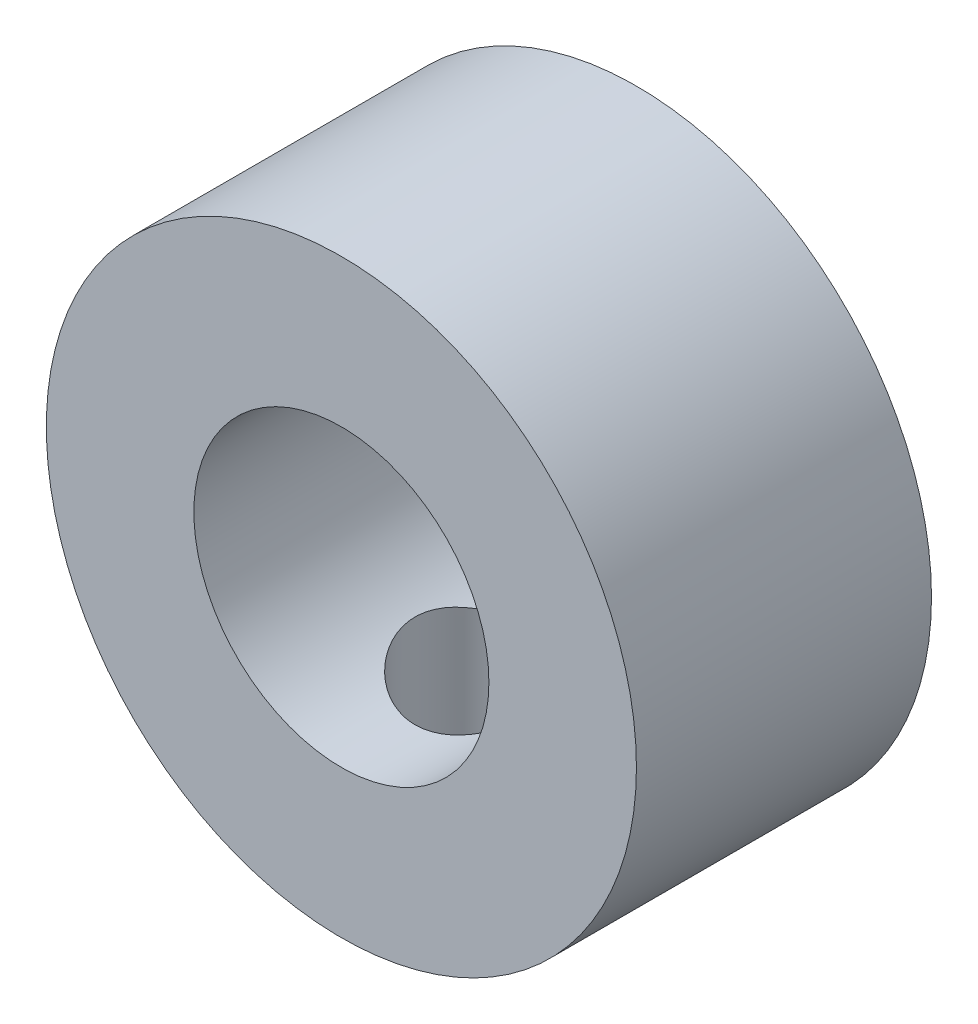
ISO-10303-21;
HEADER;
FILE_DESCRIPTION(('STEP AP214'),'2;1');
FILE_NAME('part.step','',(''),(''),'','','');
FILE_SCHEMA(('AUTOMOTIVE_DESIGN { 1 0 10303 214 1 1 1 1 }'));
ENDSEC;
DATA;
#1=APPLICATION_CONTEXT('core data for automotive mechanical design processes');
#2=APPLICATION_PROTOCOL_DEFINITION('international standard','automotive_design',2000,#1);
#3=PRODUCT_CONTEXT('',#1,'mechanical');
#4=PRODUCT('Part','Part','',(#3));
#5=PRODUCT_RELATED_PRODUCT_CATEGORY('part','',(#4));
#6=PRODUCT_DEFINITION_FORMATION('','',#4);
#7=PRODUCT_DEFINITION_CONTEXT('part definition',#1,'design');
#8=PRODUCT_DEFINITION('design','',#6,#7);
#9=PRODUCT_DEFINITION_SHAPE('','',#8);
#10=(LENGTH_UNIT() NAMED_UNIT(*) SI_UNIT(.MILLI.,.METRE.));
#11=(NAMED_UNIT(*) PLANE_ANGLE_UNIT() SI_UNIT($,.RADIAN.));
#12=(NAMED_UNIT(*) SI_UNIT($,.STERADIAN.) SOLID_ANGLE_UNIT());
#13=UNCERTAINTY_MEASURE_WITH_UNIT(LENGTH_MEASURE(1.E-05),#10,'distance_accuracy_value','');
#14=(GEOMETRIC_REPRESENTATION_CONTEXT(3) GLOBAL_UNCERTAINTY_ASSIGNED_CONTEXT((#13)) GLOBAL_UNIT_ASSIGNED_CONTEXT((#10,
#11,#12)) REPRESENTATION_CONTEXT('',''));
#15=CARTESIAN_POINT('',(0.,0.,0.));
#16=DIRECTION('',(0.,0.,1.));
#17=DIRECTION('',(1.,0.,0.));
#18=AXIS2_PLACEMENT_3D('',#15,#16,#17);
#19=CARTESIAN_POINT('',(0.,0.,8.));
#20=DIRECTION('',(0.,0.,1.));
#21=DIRECTION('',(1.,0.,0.));
#22=AXIS2_PLACEMENT_3D('',#19,#20,#21);
#23=PLANE('',#22);
#24=CARTESIAN_POINT('',(0.,0.,8.));
#25=DIRECTION('',(0.,0.,1.));
#26=DIRECTION('',(1.,0.,0.));
#27=AXIS2_PLACEMENT_3D('',#24,#25,#26);
#28=CIRCLE('',#27,8.);
#29=CARTESIAN_POINT('',(8.,0.,8.));
#30=VERTEX_POINT('',#29);
#31=EDGE_CURVE('E10',#30,#30,#28,.T.);
#32=ORIENTED_EDGE('',*,*,#31,.T.);
#33=EDGE_LOOP('',(#32));
#34=FACE_BOUND('',#33,.T.);
#35=CARTESIAN_POINT('',(0.,0.,8.));
#36=DIRECTION('',(0.,0.,1.));
#37=DIRECTION('',(1.,0.,0.));
#38=AXIS2_PLACEMENT_3D('',#35,#36,#37);
#39=CIRCLE('',#38,4.);
#40=CARTESIAN_POINT('',(4.,0.,8.));
#41=VERTEX_POINT('',#40);
#42=EDGE_CURVE('E50',#41,#41,#39,.T.);
#43=ORIENTED_EDGE('',*,*,#42,.F.);
#44=EDGE_LOOP('',(#43));
#45=FACE_BOUND('',#44,.T.);
#46=ADVANCED_FACE('F31',(#34,#45),#23,.T.);
#47=CARTESIAN_POINT('',(0.,0.,0.));
#48=DIRECTION('',(0.,0.,1.));
#49=DIRECTION('',(1.,0.,0.));
#50=AXIS2_PLACEMENT_3D('',#47,#48,#49);
#51=PLANE('',#50);
#52=CARTESIAN_POINT('',(0.,0.,0.));
#53=DIRECTION('',(0.,0.,1.));
#54=DIRECTION('',(1.,0.,0.));
#55=AXIS2_PLACEMENT_3D('',#52,#53,#54);
#56=CIRCLE('',#55,8.);
#57=CARTESIAN_POINT('',(8.,0.,0.));
#58=VERTEX_POINT('',#57);
#59=EDGE_CURVE('E45',#58,#58,#56,.T.);
#60=ORIENTED_EDGE('',*,*,#59,.F.);
#61=EDGE_LOOP('',(#60));
#62=FACE_BOUND('',#61,.T.);
#63=CARTESIAN_POINT('',(0.,0.,0.));
#64=DIRECTION('',(0.,0.,1.));
#65=DIRECTION('',(1.,0.,0.));
#66=AXIS2_PLACEMENT_3D('',#63,#64,#65);
#67=CIRCLE('',#66,4.);
#68=CARTESIAN_POINT('',(4.,0.,0.));
#69=VERTEX_POINT('',#68);
#70=EDGE_CURVE('E52',#69,#69,#67,.T.);
#71=ORIENTED_EDGE('',*,*,#70,.T.);
#72=EDGE_LOOP('',(#71));
#73=FACE_BOUND('',#72,.T.);
#74=ADVANCED_FACE('F73',(#62,#73),#51,.F.);
#75=CARTESIAN_POINT('',(0.,0.,8.));
#76=DIRECTION('',(0.,0.,-1.));
#77=DIRECTION('',(-1.,0.,0.));
#78=AXIS2_PLACEMENT_3D('',#75,#76,#77);
#79=CYLINDRICAL_SURFACE('',#78,8.);
#80=CARTESIAN_POINT('',(0.,-8.,6.));
#81=CARTESIAN_POINT('',(0.110501451559641,-7.9999981315735,5.99999689901579));
#82=CARTESIAN_POINT('',(0.221037543774351,-7.99768770842435,5.99081126563495));
#83=CARTESIAN_POINT('',(0.438941765027377,-7.98869485106526,5.95436646492399));
#84=CARTESIAN_POINT('',(0.546308062494319,-7.98200993893301,5.92709705394953));
#85=CARTESIAN_POINT('',(0.754694496243435,-7.96500835109376,5.85541432871722));
#86=CARTESIAN_POINT('',(0.855722084573335,-7.95469603789411,5.81102160171297));
#87=CARTESIAN_POINT('',(1.04889617587257,-7.93153791743495,5.70642481327354));
#88=CARTESIAN_POINT('',(1.14104237913168,-7.91869202472209,5.64622021850804));
#89=CARTESIAN_POINT('',(1.31573590306789,-7.89156551455591,5.51039894712776));
#90=CARTESIAN_POINT('',(1.39807425341474,-7.87726276197502,5.43451790005459));
#91=CARTESIAN_POINT('',(1.54899856960443,-7.84898160157248,5.27006372678795));
#92=CARTESIAN_POINT('',(1.61758298259892,-7.83500323053157,5.18148916940409));
#93=CARTESIAN_POINT('',(1.74003539039863,-7.80873034264225,4.99253969768401));
#94=CARTESIAN_POINT('',(1.79366962123352,-7.79646392619748,4.89200902558836));
#95=CARTESIAN_POINT('',(1.88319587806766,-7.77532659757355,4.68300211778662));
#96=CARTESIAN_POINT('',(1.91909074058685,-7.76645514259225,4.57452715555731));
#97=CARTESIAN_POINT('',(1.97140644907302,-7.7533396892843,4.35500866906445));
#98=CARTESIAN_POINT('',(1.98820302444274,-7.74900654662681,4.24406013861601));
#99=CARTESIAN_POINT('',(2.00301570008854,-7.74519149946122,4.02084190800087));
#100=CARTESIAN_POINT('',(2.00103485575748,-7.74570880570571,3.90857242574382));
#101=CARTESIAN_POINT('',(1.97864869951961,-7.75145607355756,3.6887789230062));
#102=CARTESIAN_POINT('',(1.95869112025418,-7.75657150676391,3.58120583804623));
#103=CARTESIAN_POINT('',(1.90163224920399,-7.77075612894758,3.37098526545192));
#104=CARTESIAN_POINT('',(1.86452973609252,-7.77982559958985,3.26833812929477));
#105=CARTESIAN_POINT('',(1.77385263724958,-7.80100151874212,3.06968264499716));
#106=CARTESIAN_POINT('',(1.72011555631056,-7.81313769959755,2.97375177094724));
#107=CARTESIAN_POINT('',(1.59780836801993,-7.83906281127988,2.79210838699091));
#108=CARTESIAN_POINT('',(1.52923566507845,-7.85285203112837,2.70639766924367));
#109=CARTESIAN_POINT('',(1.37688456624163,-7.88101174053188,2.5450618457408));
#110=CARTESIAN_POINT('',(1.29272834422115,-7.89538759304001,2.46979401325153));
#111=CARTESIAN_POINT('',(1.11281589000493,-7.92274620771675,2.3343716767148));
#112=CARTESIAN_POINT('',(1.01705930361059,-7.93572892732543,2.27421763431525));
#113=CARTESIAN_POINT('',(0.816154518241856,-7.9589030945892,2.17059921836749));
#114=CARTESIAN_POINT('',(0.710975190944832,-7.96908480170303,2.12719287966076));
#115=CARTESIAN_POINT('',(0.494501344190511,-7.98543889321888,2.05877692572057));
#116=CARTESIAN_POINT('',(0.383207998867313,-7.99161204452374,2.03376379144248));
#117=CARTESIAN_POINT('',(0.160719960520036,-7.999139990285,2.00338991258822));
#118=CARTESIAN_POINT('',(0.0495956266509469,-8.00061404677705,1.9975426318996));
#119=CARTESIAN_POINT('',(-0.172043833068677,-7.99891739752601,2.00433200274065));
#120=CARTESIAN_POINT('',(-0.282559012859459,-7.99574710989128,2.01696699039884));
#121=CARTESIAN_POINT('',(-0.498152358368655,-7.98519441503143,2.05996121118851));
#122=CARTESIAN_POINT('',(-0.603286825291672,-7.97787512247748,2.09005501796932));
#123=CARTESIAN_POINT('',(-0.807009723270015,-7.95984942178845,2.16680944537126));
#124=CARTESIAN_POINT('',(-0.905597492043512,-7.94914267159856,2.21347173908423));
#125=CARTESIAN_POINT('',(-1.0953641792398,-7.92524410568414,2.3229815051663));
#126=CARTESIAN_POINT('',(-1.18638058911444,-7.91201156489243,2.38610148319568));
#127=CARTESIAN_POINT('',(-1.35670215152433,-7.88459345583226,2.52638654506263));
#128=CARTESIAN_POINT('',(-1.43600527863068,-7.87040772335606,2.60355405282254));
#129=CARTESIAN_POINT('',(-1.58265409076364,-7.84225275947695,2.77200261445929));
#130=CARTESIAN_POINT('',(-1.64965849016271,-7.82829738916375,2.86358360400323));
#131=CARTESIAN_POINT('',(-1.7673476786836,-7.80257171169652,3.05697684595429));
#132=CARTESIAN_POINT('',(-1.81803319221058,-7.79080130756035,3.15878864394634));
#133=CARTESIAN_POINT('',(-1.90126856081239,-7.77090792979554,3.3692076298841));
#134=CARTESIAN_POINT('',(-1.93392586220542,-7.76276340389208,3.47777017112535));
#135=CARTESIAN_POINT('',(-1.98046087993837,-7.75102325453578,3.69907951718548));
#136=CARTESIAN_POINT('',(-1.99434270330488,-7.74742663626581,3.81182540137665));
#137=CARTESIAN_POINT('',(-2.00271812044533,-7.74526534938609,4.03482803180694));
#138=CARTESIAN_POINT('',(-1.99775719704016,-7.74655910304351,4.14506324683297));
#139=CARTESIAN_POINT('',(-1.96983637108382,-7.7537054534379,4.36307185155731));
#140=CARTESIAN_POINT('',(-1.94687683024903,-7.75955795855809,4.47084529068487));
#141=CARTESIAN_POINT('',(-1.88390842592373,-7.77508347576963,4.68027794542054));
#142=CARTESIAN_POINT('',(-1.84400187290717,-7.78473353648412,4.78196974032028));
#143=CARTESIAN_POINT('',(-1.74835321814009,-7.80677007633105,4.97728717695158));
#144=CARTESIAN_POINT('',(-1.69260892004558,-7.81915693494364,5.07091169758255));
#145=CARTESIAN_POINT('',(-1.56515699818285,-7.84567512351349,5.25007283866936));
#146=CARTESIAN_POINT('',(-1.49307088388301,-7.85984353109009,5.33533476456528));
#147=CARTESIAN_POINT('',(-1.33571916158631,-7.88810702995048,5.49272939306054));
#148=CARTESIAN_POINT('',(-1.25045042834819,-7.90220210302746,5.56485897348396));
#149=CARTESIAN_POINT('',(-1.06729011560345,-7.92903540863551,5.69521507808614));
#150=CARTESIAN_POINT('',(-0.969197896421848,-7.94174444487824,5.75316615156211));
#151=CARTESIAN_POINT('',(-0.764354746013967,-7.96406566633491,5.85166328392071));
#152=CARTESIAN_POINT('',(-0.657610084582319,-7.97368006933042,5.89222181419805));
#153=CARTESIAN_POINT('',(-0.459213670991296,-7.98730746087389,5.94876244043954));
#154=CARTESIAN_POINT('',(-0.368506894544092,-7.9920344673692,5.96793499073791));
#155=CARTESIAN_POINT('',(-0.185208095381712,-7.99838140309264,5.99355459149592));
#156=CARTESIAN_POINT('',(-0.0926162149901553,-8.00000156601192,6.00000259907373));
#157=CARTESIAN_POINT('',(0.,-8.,6.));
#158=B_SPLINE_CURVE_WITH_KNOTS('',3,(#80,#81,#82,#83,#84,#85,#86,#87,#88,#89,#90,#91,#92,#93,
#94,#95,#96,#97,#98,#99,#100,#101,#102,#103,#104,#105,#106,#107,#108,#109,#110,#111,#112,#113,
#114,#115,#116,#117,#118,#119,#120,#121,#122,#123,#124,#125,#126,#127,#128,#129,#130,#131,#132,
#133,#134,#135,#136,#137,#138,#139,#140,#141,#142,#143,#144,#145,#146,#147,#148,#149,#150,#151,
#152,#153,#154,#155,#156,#157),.UNSPECIFIED.,.T.,.F.,(4,2,2,2,2,2,2,2,2,2,2,2,2,2,2,2,2,2,2,2,2,
2,2,2,2,2,2,2,2,2,2,2,2,2,2,2,2,2,4),(0.,0.331164949962519,0.662517650351866,0.99347320304814,
1.32443992022577,1.66152580582852,1.99864972773416,2.34078196727742,2.68285948225824,
3.01808393468093,3.3532538415469,3.68029996013785,4.00736937959145,4.337740371696,
4.66816921119311,5.00802001296453,5.34788119415424,5.6889097201658,6.02987298255951,
6.36211078603462,6.69431868154751,7.02160366023144,7.34892169767481,7.68204783424897,
8.01523150681786,8.35659345610395,8.69794025003772,9.03723006156476,9.37644564340971,
9.70591707202578,10.0353818794581,10.3628853408369,10.6904342418696,11.0265276855097,
11.3627009303165,11.7049624733721,12.0469781843289,12.3245632392729,12.6021274139515),.UNSPECIFIED.);
#159=CARTESIAN_POINT('',(0.,-8.,6.));
#160=VERTEX_POINT('',#159);
#161=EDGE_CURVE('E55',#160,#160,#158,.T.);
#162=ORIENTED_EDGE('',*,*,#161,.T.);
#163=EDGE_LOOP('',(#162));
#164=FACE_BOUND('',#163,.T.);
#165=ORIENTED_EDGE('',*,*,#31,.F.);
#166=EDGE_LOOP('',(#165));
#167=FACE_BOUND('',#166,.T.);
#168=ORIENTED_EDGE('',*,*,#59,.T.);
#169=EDGE_LOOP('',(#168));
#170=FACE_BOUND('',#169,.T.);
#171=ADVANCED_FACE('F33',(#164,#167,#170),#79,.T.);
#172=CARTESIAN_POINT('',(0.,0.,8.));
#173=DIRECTION('',(0.,0.,-1.));
#174=DIRECTION('',(-1.,0.,0.));
#175=AXIS2_PLACEMENT_3D('',#172,#173,#174);
#176=CYLINDRICAL_SURFACE('',#175,4.);
#177=CARTESIAN_POINT('',(0.,-4.,6.));
#178=CARTESIAN_POINT('',(0.105143925902467,-3.99999426810082,5.99999339536562));
#179=CARTESIAN_POINT('',(0.210413199395125,-3.99580982039513,5.99165985375789));
#180=CARTESIAN_POINT('',(0.417840470537792,-3.97948312074314,5.95869423931692));
#181=CARTESIAN_POINT('',(0.519992173427259,-3.96732575657839,5.93403121400437));
#182=CARTESIAN_POINT('',(0.717867089760898,-3.93632558806751,5.86961238276674));
#183=CARTESIAN_POINT('',(0.813613605878292,-3.91750878355075,5.82991523150406));
#184=CARTESIAN_POINT('',(0.996945233613197,-3.87491553031523,5.73685875727003));
#185=CARTESIAN_POINT('',(1.08453098798012,-3.85113947267051,5.68350051150227));
#186=CARTESIAN_POINT('',(1.25501563552382,-3.79912516516124,5.56096550102943));
#187=CARTESIAN_POINT('',(1.33731042224422,-3.77070398255074,5.49102704152072));
#188=CARTESIAN_POINT('',(1.48955888973396,-3.71319940493486,5.33895704150593));
#189=CARTESIAN_POINT('',(1.55950316621353,-3.68411552418069,5.25681629645512));
#190=CARTESIAN_POINT('',(1.69050400090056,-3.62597902394695,5.07503330095324));
#191=CARTESIAN_POINT('',(1.75045067110327,-3.59710373940264,4.97452780330817));
#192=CARTESIAN_POINT('',(1.85233645378139,-3.54571957544641,4.76326532802757));
#193=CARTESIAN_POINT('',(1.89428842993267,-3.52320615213979,4.6525157425545));
#194=CARTESIAN_POINT('',(1.95626488437718,-3.48915734075617,4.43066978915615));
#195=CARTESIAN_POINT('',(1.97745171416088,-3.47704543167427,4.31999109586521));
#196=CARTESIAN_POINT('',(2.00085398661769,-3.46363779897055,4.09604232444105));
#197=CARTESIAN_POINT('',(2.00308817674615,-3.46233138686576,3.98277491825769));
#198=CARTESIAN_POINT('',(1.98937457434459,-3.47021860514497,3.77142795136926));
#199=CARTESIAN_POINT('',(1.97556911907364,-3.47817527324027,3.6731519375539));
#200=CARTESIAN_POINT('',(1.93387969811386,-3.50152457467701,3.48055618125392));
#201=CARTESIAN_POINT('',(1.9059912477953,-3.51691957663553,3.38623770938937));
#202=CARTESIAN_POINT('',(1.83641956077201,-3.55374952825482,3.20154173486868));
#203=CARTESIAN_POINT('',(1.79443013423199,-3.57531681327997,3.11130720242842));
#204=CARTESIAN_POINT('',(1.698083375336,-3.62206808562807,2.93873141481998));
#205=CARTESIAN_POINT('',(1.64372048762493,-3.64725369560381,2.85639372879982));
#206=CARTESIAN_POINT('',(1.51613210982558,-3.70226315806572,2.69095749451355));
#207=CARTESIAN_POINT('',(1.44138891673856,-3.73227020473492,2.60908625284769));
#208=CARTESIAN_POINT('',(1.27911115748275,-3.79095246600814,2.4585291628182));
#209=CARTESIAN_POINT('',(1.19157051314857,-3.81962703917602,2.38984961593223));
#210=CARTESIAN_POINT('',(1.0010330116637,-3.87403974565928,2.26462867794055));
#211=CARTESIAN_POINT('',(0.897507183198817,-3.89957968324015,2.20879905510852));
#212=CARTESIAN_POINT('',(0.680932430977593,-3.94315762242485,2.11580594191398));
#213=CARTESIAN_POINT('',(0.567891152530551,-3.96120157887106,2.07862762996967));
#214=CARTESIAN_POINT('',(0.345532983321404,-3.98648667482871,2.02704919256665));
#215=CARTESIAN_POINT('',(0.236683061096652,-3.9944987660262,2.01101752850644));
#216=CARTESIAN_POINT('',(0.0175591998987024,-4.00146026918207,1.99707053773103));
#217=CARTESIAN_POINT('',(-0.0927140397398181,-4.00041397442637,1.99914662872106));
#218=CARTESIAN_POINT('',(-0.302465943971974,-3.9898238450687,2.02041337683749));
#219=CARTESIAN_POINT('',(-0.402118816099861,-3.98094491376337,2.03826506545999));
#220=CARTESIAN_POINT('',(-0.596813784603883,-3.9564434262968,2.08847614379024));
#221=CARTESIAN_POINT('',(-0.691855371382175,-3.94082012668824,2.12083713290699));
#222=CARTESIAN_POINT('',(-0.877777216899146,-3.90368502827176,2.19999693286607));
#223=CARTESIAN_POINT('',(-0.968460794011607,-3.88201763539261,2.24718210023257));
#224=CARTESIAN_POINT('',(-1.14092272339854,-3.83487948634835,2.35421507129314));
#225=CARTESIAN_POINT('',(-1.22269725955318,-3.80940711133877,2.41406826919079));
#226=CARTESIAN_POINT('',(-1.38353537857843,-3.75416442672396,2.55152085066143));
#227=CARTESIAN_POINT('',(-1.46154415563805,-3.72421769686998,2.6302857368903));
#228=CARTESIAN_POINT('',(-1.60371264223771,-3.6652478321764,2.79985030255546));
#229=CARTESIAN_POINT('',(-1.66786277142375,-3.63622534800094,2.89065823769584));
#230=CARTESIAN_POINT('',(-1.78341582895804,-3.58102384412979,3.08728730834595));
#231=CARTESIAN_POINT('',(-1.8340509916005,-3.55505059178121,3.19362253218896));
#232=CARTESIAN_POINT('',(-1.91616565186941,-3.51148144588269,3.41502013514993));
#233=CARTESIAN_POINT('',(-1.94766983173403,-3.493874764435,3.53007105293378));
#234=CARTESIAN_POINT('',(-1.98772337493374,-3.47123002051604,3.75382044576941));
#235=CARTESIAN_POINT('',(-1.9981859928109,-3.4651476693013,3.86206850687048));
#236=CARTESIAN_POINT('',(-2.0013783087524,-3.46330709283206,4.07889413432905));
#237=CARTESIAN_POINT('',(-1.99411569324648,-3.4675443925278,4.18747153747572));
#238=CARTESIAN_POINT('',(-1.96385225118662,-3.48475724102153,4.39096700306687));
#239=CARTESIAN_POINT('',(-1.94241662868607,-3.49686188965317,4.48620094028948));
#240=CARTESIAN_POINT('',(-1.88635071644882,-3.52742032375305,4.67161623884873));
#241=CARTESIAN_POINT('',(-1.85171618231984,-3.54587615139337,4.76179596418406));
#242=CARTESIAN_POINT('',(-1.76763149060113,-3.58857060729071,4.94124970197308));
#243=CARTESIAN_POINT('',(-1.7173422756314,-3.61311444791841,5.03005580365806));
#244=CARTESIAN_POINT('',(-1.60430194327478,-3.66470663269721,5.19854907236252));
#245=CARTESIAN_POINT('',(-1.54154434248312,-3.69175627591221,5.27823146104222));
#246=CARTESIAN_POINT('',(-1.39640665332275,-3.74924646316184,5.43628396470935));
#247=CARTESIAN_POINT('',(-1.31256884599452,-3.77969966613256,5.51331820470058));
#248=CARTESIAN_POINT('',(-1.13230961246639,-3.83755504519861,5.65252596687054));
#249=CARTESIAN_POINT('',(-1.03588144661039,-3.8649555725239,5.71469147893981));
#250=CARTESIAN_POINT('',(-0.831863193565891,-3.91396019133075,5.82247272542414));
#251=CARTESIAN_POINT('',(-0.72419900755346,-3.93552192987866,5.86796833847294));
#252=CARTESIAN_POINT('',(-0.501484202276172,-3.97002682597974,5.93961633551482));
#253=CARTESIAN_POINT('',(-0.386455599178199,-3.98299446726136,5.96582369361143));
#254=CARTESIAN_POINT('',(-0.22520389298179,-3.99390923826956,5.98779482217148));
#255=CARTESIAN_POINT('',(-0.180323758883129,-3.99618730680502,5.99236528173268));
#256=CARTESIAN_POINT('',(-0.090303463610183,-3.99923393953631,5.99846933102817));
#257=CARTESIAN_POINT('',(-0.0451632952932568,-4.00000246206762,6.00000283694042));
#258=CARTESIAN_POINT('',(0.,-4.,6.));
#259=B_SPLINE_CURVE_WITH_KNOTS('',3,(#177,#178,#179,#180,#181,#182,#183,#184,#185,#186,#187,
#188,#189,#190,#191,#192,#193,#194,#195,#196,#197,#198,#199,#200,#201,#202,#203,#204,#205,#206,
#207,#208,#209,#210,#211,#212,#213,#214,#215,#216,#217,#218,#219,#220,#221,#222,#223,#224,#225,
#226,#227,#228,#229,#230,#231,#232,#233,#234,#235,#236,#237,#238,#239,#240,#241,#242,#243,#244,
#245,#246,#247,#248,#249,#250,#251,#252,#253,#254,#255,#256,#257,#258),.UNSPECIFIED.,.T.,.F.,(4,
2,2,2,2,2,2,2,2,2,2,2,2,2,2,2,2,2,2,2,2,2,2,2,2,2,2,2,2,2,2,2,2,2,2,2,2,2,2,2,4),(0.,
0.315248514840585,0.631096299418395,0.945724310984597,1.26032752116314,1.59396351743618,
1.92785247530807,2.28763452861505,2.64715895796562,2.98516024280459,3.32282714658041,
3.62011424818641,3.91749607851357,4.22180480336975,4.52625042520444,4.86929882667757,
5.21251069197373,5.57166044428881,5.93052433824559,6.25966580942691,6.58865129022952,
6.89213813012244,7.19565843261863,7.50785712055797,7.82018901496678,8.16319221288838,
8.50643177230864,8.86629364323452,9.22569023890902,9.55058615006093,9.87534119729357,
10.1691586049771,10.463070575767,10.7767291356057,11.0905512228726,11.4425048551434,
11.7946476676249,12.1492802732705,12.502898172423,12.6383056026783,12.7737167702213),.UNSPECIFIED.);
#260=CARTESIAN_POINT('',(0.,-4.,6.));
#261=VERTEX_POINT('',#260);
#262=EDGE_CURVE('E36',#261,#261,#259,.T.);
#263=ORIENTED_EDGE('',*,*,#262,.F.);
#264=EDGE_LOOP('',(#263));
#265=FACE_BOUND('',#264,.T.);
#266=ORIENTED_EDGE('',*,*,#42,.T.);
#267=EDGE_LOOP('',(#266));
#268=FACE_BOUND('',#267,.T.);
#269=ORIENTED_EDGE('',*,*,#70,.F.);
#270=EDGE_LOOP('',(#269));
#271=FACE_BOUND('',#270,.T.);
#272=ADVANCED_FACE('F65',(#265,#268,#271),#176,.F.);
#273=CARTESIAN_POINT('',(0.,-8.,4.));
#274=DIRECTION('',(0.,1.,0.));
#275=DIRECTION('',(0.,0.,1.));
#276=AXIS2_PLACEMENT_3D('',#273,#274,#275);
#277=CYLINDRICAL_SURFACE('',#276,2.);
#278=ORIENTED_EDGE('',*,*,#262,.T.);
#279=EDGE_LOOP('',(#278));
#280=FACE_BOUND('',#279,.T.);
#281=ORIENTED_EDGE('',*,*,#161,.F.);
#282=EDGE_LOOP('',(#281));
#283=FACE_BOUND('',#282,.T.);
#284=ADVANCED_FACE('F62',(#280,#283),#277,.F.);
#285=CLOSED_SHELL('',(#46,#74,#171,#272,#284));
#286=MANIFOLD_SOLID_BREP('B2',#285);
#287=ADVANCED_BREP_SHAPE_REPRESENTATION('',(#18,#286),#14);
#288=SHAPE_DEFINITION_REPRESENTATION(#9,#287);
ENDSEC;
END-ISO-10303-21;
